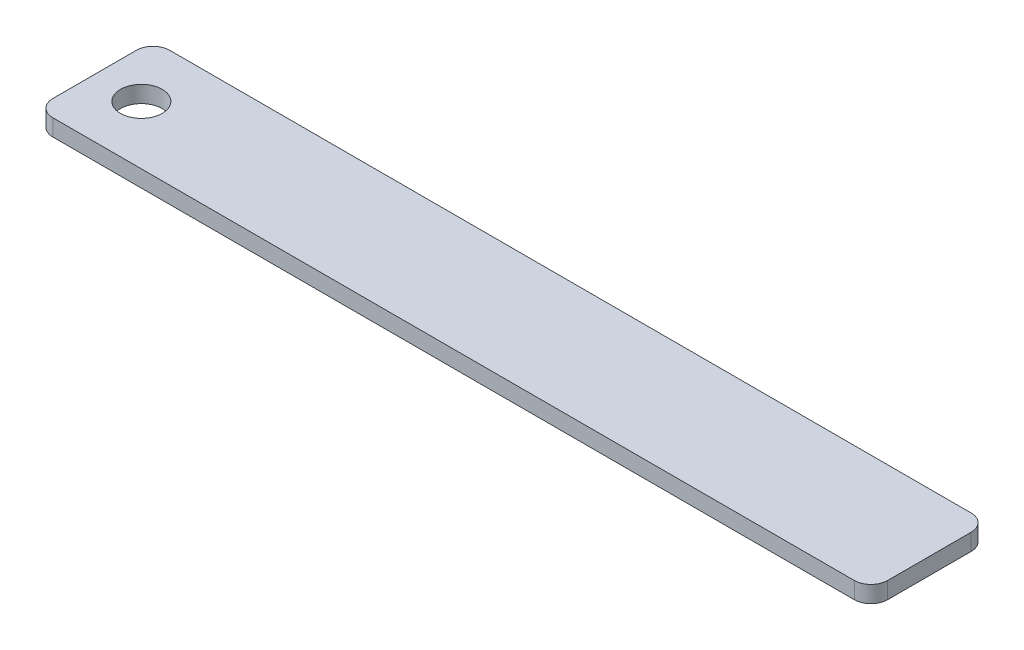
ISO-10303-21;
HEADER;
FILE_DESCRIPTION(('STEP AP214'),'2;1');
FILE_NAME('part.step','',(''),(''),'','','');
FILE_SCHEMA(('AUTOMOTIVE_DESIGN { 1 0 10303 214 1 1 1 1 }'));
ENDSEC;
DATA;
#1=APPLICATION_CONTEXT('core data for automotive mechanical design processes');
#2=APPLICATION_PROTOCOL_DEFINITION('international standard','automotive_design',2000,#1);
#3=PRODUCT_CONTEXT('',#1,'mechanical');
#4=PRODUCT('Part','Part','',(#3));
#5=PRODUCT_RELATED_PRODUCT_CATEGORY('part','',(#4));
#6=PRODUCT_DEFINITION_FORMATION('','',#4);
#7=PRODUCT_DEFINITION_CONTEXT('part definition',#1,'design');
#8=PRODUCT_DEFINITION('design','',#6,#7);
#9=PRODUCT_DEFINITION_SHAPE('','',#8);
#10=(LENGTH_UNIT() NAMED_UNIT(*) SI_UNIT(.MILLI.,.METRE.));
#11=(NAMED_UNIT(*) PLANE_ANGLE_UNIT() SI_UNIT($,.RADIAN.));
#12=(NAMED_UNIT(*) SI_UNIT($,.STERADIAN.) SOLID_ANGLE_UNIT());
#13=UNCERTAINTY_MEASURE_WITH_UNIT(LENGTH_MEASURE(1.E-05),#10,'distance_accuracy_value','');
#14=(GEOMETRIC_REPRESENTATION_CONTEXT(3) GLOBAL_UNCERTAINTY_ASSIGNED_CONTEXT((#13)) GLOBAL_UNIT_ASSIGNED_CONTEXT((#10,
#11,#12)) REPRESENTATION_CONTEXT('',''));
#15=CARTESIAN_POINT('',(0.,0.,0.));
#16=DIRECTION('',(0.,0.,1.));
#17=DIRECTION('',(1.,0.,0.));
#18=AXIS2_PLACEMENT_3D('',#15,#16,#17);
#19=CARTESIAN_POINT('',(0.,1.27,0.));
#20=DIRECTION('',(0.,-1.,0.));
#21=DIRECTION('',(0.,0.,-1.));
#22=AXIS2_PLACEMENT_3D('',#19,#20,#21);
#23=PLANE('',#22);
#24=DIRECTION('',(-1.,0.,0.));
#25=VECTOR('',#24,1.);
#26=CARTESIAN_POINT('',(-31.75,1.27,-4.445));
#27=LINE('',#26,#25);
#28=CARTESIAN_POINT('',(30.48,1.27,-4.445));
#29=VERTEX_POINT('',#28);
#30=CARTESIAN_POINT('',(-30.48,1.27,-4.445));
#31=VERTEX_POINT('',#30);
#32=EDGE_CURVE('E171',#29,#31,#27,.T.);
#33=ORIENTED_EDGE('',*,*,#32,.T.);
#34=CARTESIAN_POINT('',(-30.48,1.27,-3.175));
#35=DIRECTION('',(0.,-1.,0.));
#36=DIRECTION('',(0.,0.,-1.));
#37=AXIS2_PLACEMENT_3D('',#34,#35,#36);
#38=CIRCLE('',#37,1.27);
#39=CARTESIAN_POINT('',(-31.75,1.27,-3.175));
#40=VERTEX_POINT('',#39);
#41=EDGE_CURVE('E148',#31,#40,#38,.F.);
#42=ORIENTED_EDGE('',*,*,#41,.T.);
#43=DIRECTION('',(0.,0.,1.));
#44=VECTOR('',#43,1.);
#45=CARTESIAN_POINT('',(-31.75,1.27,4.445));
#46=LINE('',#45,#44);
#47=CARTESIAN_POINT('',(-31.75,1.27,3.175));
#48=VERTEX_POINT('',#47);
#49=EDGE_CURVE('E118',#40,#48,#46,.T.);
#50=ORIENTED_EDGE('',*,*,#49,.T.);
#51=CARTESIAN_POINT('',(-30.48,1.27,3.175));
#52=DIRECTION('',(0.,-1.,0.));
#53=DIRECTION('',(0.,0.,-1.));
#54=AXIS2_PLACEMENT_3D('',#51,#52,#53);
#55=CIRCLE('',#54,1.27);
#56=CARTESIAN_POINT('',(-30.48,1.27,4.445));
#57=VERTEX_POINT('',#56);
#58=EDGE_CURVE('E55',#48,#57,#55,.F.);
#59=ORIENTED_EDGE('',*,*,#58,.T.);
#60=DIRECTION('',(1.,0.,0.));
#61=VECTOR('',#60,1.);
#62=CARTESIAN_POINT('',(-31.75,1.27,4.445));
#63=LINE('',#62,#61);
#64=CARTESIAN_POINT('',(30.48,1.27,4.445));
#65=VERTEX_POINT('',#64);
#66=EDGE_CURVE('E134',#57,#65,#63,.T.);
#67=ORIENTED_EDGE('',*,*,#66,.T.);
#68=CARTESIAN_POINT('',(30.48,1.27,3.175));
#69=DIRECTION('',(0.,-1.,0.));
#70=DIRECTION('',(0.,0.,-1.));
#71=AXIS2_PLACEMENT_3D('',#68,#69,#70);
#72=CIRCLE('',#71,1.27);
#73=CARTESIAN_POINT('',(31.75,1.27,3.175));
#74=VERTEX_POINT('',#73);
#75=EDGE_CURVE('E143',#65,#74,#72,.F.);
#76=ORIENTED_EDGE('',*,*,#75,.T.);
#77=DIRECTION('',(0.,0.,-1.));
#78=VECTOR('',#77,1.);
#79=CARTESIAN_POINT('',(31.75,1.27,4.445));
#80=LINE('',#79,#78);
#81=CARTESIAN_POINT('',(31.75,1.27,-3.175));
#82=VERTEX_POINT('',#81);
#83=EDGE_CURVE('E128',#74,#82,#80,.T.);
#84=ORIENTED_EDGE('',*,*,#83,.T.);
#85=CARTESIAN_POINT('',(30.48,1.27,-3.175));
#86=DIRECTION('',(0.,-1.,0.));
#87=DIRECTION('',(0.,0.,-1.));
#88=AXIS2_PLACEMENT_3D('',#85,#86,#87);
#89=CIRCLE('',#88,1.27);
#90=EDGE_CURVE('E145',#82,#29,#89,.F.);
#91=ORIENTED_EDGE('',*,*,#90,.T.);
#92=EDGE_LOOP('',(#33,#42,#50,#59,#67,#76,#84,#91));
#93=FACE_BOUND('',#92,.T.);
#94=CARTESIAN_POINT('',(-28.194,1.27,0.));
#95=DIRECTION('',(0.,1.,0.));
#96=DIRECTION('',(0.,0.,1.));
#97=AXIS2_PLACEMENT_3D('',#94,#95,#96);
#98=CIRCLE('',#97,1.5875);
#99=CARTESIAN_POINT('',(-28.194,1.27,1.5875));
#100=VERTEX_POINT('',#99);
#101=EDGE_CURVE('E164',#100,#100,#98,.T.);
#102=ORIENTED_EDGE('',*,*,#101,.F.);
#103=EDGE_LOOP('',(#102));
#104=FACE_BOUND('',#103,.T.);
#105=ADVANCED_FACE('F33',(#93,#104),#23,.F.);
#106=CARTESIAN_POINT('',(0.,0.,0.));
#107=DIRECTION('',(0.,-1.,0.));
#108=DIRECTION('',(0.,0.,-1.));
#109=AXIS2_PLACEMENT_3D('',#106,#107,#108);
#110=PLANE('',#109);
#111=DIRECTION('',(0.,0.,1.));
#112=VECTOR('',#111,1.);
#113=CARTESIAN_POINT('',(-31.75,0.,4.445));
#114=LINE('',#113,#112);
#115=CARTESIAN_POINT('',(-31.75,0.,-3.175));
#116=VERTEX_POINT('',#115);
#117=CARTESIAN_POINT('',(-31.75,0.,3.175));
#118=VERTEX_POINT('',#117);
#119=EDGE_CURVE('E116',#116,#118,#114,.T.);
#120=ORIENTED_EDGE('',*,*,#119,.F.);
#121=CARTESIAN_POINT('',(-30.48,0.,-3.175));
#122=DIRECTION('',(0.,-1.,0.));
#123=DIRECTION('',(0.,0.,-1.));
#124=AXIS2_PLACEMENT_3D('',#121,#122,#123);
#125=CIRCLE('',#124,1.27);
#126=CARTESIAN_POINT('',(-30.48,0.,-4.445));
#127=VERTEX_POINT('',#126);
#128=EDGE_CURVE('E99',#116,#127,#125,.T.);
#129=ORIENTED_EDGE('',*,*,#128,.T.);
#130=DIRECTION('',(-1.,0.,0.));
#131=VECTOR('',#130,1.);
#132=CARTESIAN_POINT('',(-31.75,0.,-4.445));
#133=LINE('',#132,#131);
#134=CARTESIAN_POINT('',(30.48,0.,-4.445));
#135=VERTEX_POINT('',#134);
#136=EDGE_CURVE('E126',#135,#127,#133,.T.);
#137=ORIENTED_EDGE('',*,*,#136,.F.);
#138=CARTESIAN_POINT('',(30.48,0.,-3.175));
#139=DIRECTION('',(0.,-1.,0.));
#140=DIRECTION('',(0.,0.,-1.));
#141=AXIS2_PLACEMENT_3D('',#138,#139,#140);
#142=CIRCLE('',#141,1.27);
#143=CARTESIAN_POINT('',(31.75,0.,-3.175));
#144=VERTEX_POINT('',#143);
#145=EDGE_CURVE('E137',#135,#144,#142,.T.);
#146=ORIENTED_EDGE('',*,*,#145,.T.);
#147=DIRECTION('',(0.,0.,-1.));
#148=VECTOR('',#147,1.);
#149=CARTESIAN_POINT('',(31.75,0.,4.445));
#150=LINE('',#149,#148);
#151=CARTESIAN_POINT('',(31.75,0.,3.175));
#152=VERTEX_POINT('',#151);
#153=EDGE_CURVE('E130',#152,#144,#150,.T.);
#154=ORIENTED_EDGE('',*,*,#153,.F.);
#155=CARTESIAN_POINT('',(30.48,0.,3.175));
#156=DIRECTION('',(0.,-1.,0.));
#157=DIRECTION('',(0.,0.,-1.));
#158=AXIS2_PLACEMENT_3D('',#155,#156,#157);
#159=CIRCLE('',#158,1.27);
#160=CARTESIAN_POINT('',(30.48,0.,4.445));
#161=VERTEX_POINT('',#160);
#162=EDGE_CURVE('E119',#152,#161,#159,.T.);
#163=ORIENTED_EDGE('',*,*,#162,.T.);
#164=DIRECTION('',(1.,0.,0.));
#165=VECTOR('',#164,1.);
#166=CARTESIAN_POINT('',(-31.75,0.,4.445));
#167=LINE('',#166,#165);
#168=CARTESIAN_POINT('',(-30.48,0.,4.445));
#169=VERTEX_POINT('',#168);
#170=EDGE_CURVE('E125',#169,#161,#167,.T.);
#171=ORIENTED_EDGE('',*,*,#170,.F.);
#172=CARTESIAN_POINT('',(-30.48,0.,3.175));
#173=DIRECTION('',(0.,-1.,0.));
#174=DIRECTION('',(0.,0.,-1.));
#175=AXIS2_PLACEMENT_3D('',#172,#173,#174);
#176=CIRCLE('',#175,1.27);
#177=EDGE_CURVE('E110',#169,#118,#176,.T.);
#178=ORIENTED_EDGE('',*,*,#177,.T.);
#179=EDGE_LOOP('',(#120,#129,#137,#146,#154,#163,#171,#178));
#180=FACE_BOUND('',#179,.T.);
#181=CARTESIAN_POINT('',(-28.194,0.,0.));
#182=DIRECTION('',(0.,1.,0.));
#183=DIRECTION('',(0.,0.,1.));
#184=AXIS2_PLACEMENT_3D('',#181,#182,#183);
#185=CIRCLE('',#184,1.5875);
#186=CARTESIAN_POINT('',(-28.194,0.,1.5875));
#187=VERTEX_POINT('',#186);
#188=EDGE_CURVE('E166',#187,#187,#185,.T.);
#189=ORIENTED_EDGE('',*,*,#188,.T.);
#190=EDGE_LOOP('',(#189));
#191=FACE_BOUND('',#190,.T.);
#192=ADVANCED_FACE('F122',(#180,#191),#110,.T.);
#193=CARTESIAN_POINT('',(31.75,1.27,4.445));
#194=DIRECTION('',(-1.,0.,0.));
#195=DIRECTION('',(0.,0.,1.));
#196=AXIS2_PLACEMENT_3D('',#193,#194,#195);
#197=PLANE('',#196);
#198=ORIENTED_EDGE('',*,*,#153,.T.);
#199=DIRECTION('',(0.,-1.,0.));
#200=VECTOR('',#199,1.);
#201=CARTESIAN_POINT('',(31.75,1.27,-3.175));
#202=LINE('',#201,#200);
#203=EDGE_CURVE('E11',#144,#82,#202,.F.);
#204=ORIENTED_EDGE('',*,*,#203,.T.);
#205=ORIENTED_EDGE('',*,*,#83,.F.);
#206=DIRECTION('',(0.,-1.,0.));
#207=VECTOR('',#206,1.);
#208=CARTESIAN_POINT('',(31.75,1.27,3.175));
#209=LINE('',#208,#207);
#210=EDGE_CURVE('E41',#74,#152,#209,.T.);
#211=ORIENTED_EDGE('',*,*,#210,.T.);
#212=EDGE_LOOP('',(#198,#204,#205,#211));
#213=FACE_BOUND('',#212,.T.);
#214=ADVANCED_FACE('F159',(#213),#197,.F.);
#215=CARTESIAN_POINT('',(-31.75,1.27,-4.445));
#216=DIRECTION('',(0.,0.,1.));
#217=DIRECTION('',(1.,0.,0.));
#218=AXIS2_PLACEMENT_3D('',#215,#216,#217);
#219=PLANE('',#218);
#220=ORIENTED_EDGE('',*,*,#136,.T.);
#221=DIRECTION('',(0.,-1.,0.));
#222=VECTOR('',#221,1.);
#223=CARTESIAN_POINT('',(-30.48,1.27,-4.445));
#224=LINE('',#223,#222);
#225=EDGE_CURVE('E104',#127,#31,#224,.F.);
#226=ORIENTED_EDGE('',*,*,#225,.T.);
#227=ORIENTED_EDGE('',*,*,#32,.F.);
#228=DIRECTION('',(0.,-1.,0.));
#229=VECTOR('',#228,1.);
#230=CARTESIAN_POINT('',(30.48,1.27,-4.445));
#231=LINE('',#230,#229);
#232=EDGE_CURVE('E109',#29,#135,#231,.T.);
#233=ORIENTED_EDGE('',*,*,#232,.T.);
#234=EDGE_LOOP('',(#220,#226,#227,#233));
#235=FACE_BOUND('',#234,.T.);
#236=ADVANCED_FACE('F200',(#235),#219,.F.);
#237=CARTESIAN_POINT('',(-31.75,1.27,4.445));
#238=DIRECTION('',(1.,0.,0.));
#239=DIRECTION('',(0.,0.,-1.));
#240=AXIS2_PLACEMENT_3D('',#237,#238,#239);
#241=PLANE('',#240);
#242=ORIENTED_EDGE('',*,*,#49,.F.);
#243=DIRECTION('',(0.,-1.,0.));
#244=VECTOR('',#243,1.);
#245=CARTESIAN_POINT('',(-31.75,1.27,-3.175));
#246=LINE('',#245,#244);
#247=EDGE_CURVE('E103',#40,#116,#246,.T.);
#248=ORIENTED_EDGE('',*,*,#247,.T.);
#249=ORIENTED_EDGE('',*,*,#119,.T.);
#250=DIRECTION('',(0.,-1.,0.));
#251=VECTOR('',#250,1.);
#252=CARTESIAN_POINT('',(-31.75,1.27,3.175));
#253=LINE('',#252,#251);
#254=EDGE_CURVE('E120',#118,#48,#253,.F.);
#255=ORIENTED_EDGE('',*,*,#254,.T.);
#256=EDGE_LOOP('',(#242,#248,#249,#255));
#257=FACE_BOUND('',#256,.T.);
#258=ADVANCED_FACE('F115',(#257),#241,.F.);
#259=CARTESIAN_POINT('',(-31.75,1.27,4.445));
#260=DIRECTION('',(0.,0.,-1.));
#261=DIRECTION('',(-1.,0.,0.));
#262=AXIS2_PLACEMENT_3D('',#259,#260,#261);
#263=PLANE('',#262);
#264=ORIENTED_EDGE('',*,*,#66,.F.);
#265=DIRECTION('',(0.,-1.,0.));
#266=VECTOR('',#265,1.);
#267=CARTESIAN_POINT('',(-30.48,1.27,4.445));
#268=LINE('',#267,#266);
#269=EDGE_CURVE('E151',#57,#169,#268,.T.);
#270=ORIENTED_EDGE('',*,*,#269,.T.);
#271=ORIENTED_EDGE('',*,*,#170,.T.);
#272=DIRECTION('',(0.,-1.,0.));
#273=VECTOR('',#272,1.);
#274=CARTESIAN_POINT('',(30.48,1.27,4.445));
#275=LINE('',#274,#273);
#276=EDGE_CURVE('E48',#161,#65,#275,.F.);
#277=ORIENTED_EDGE('',*,*,#276,.T.);
#278=EDGE_LOOP('',(#264,#270,#271,#277));
#279=FACE_BOUND('',#278,.T.);
#280=ADVANCED_FACE('F180',(#279),#263,.F.);
#281=CARTESIAN_POINT('',(-28.194,1.27,0.));
#282=DIRECTION('',(0.,-1.,0.));
#283=DIRECTION('',(0.,0.,-1.));
#284=AXIS2_PLACEMENT_3D('',#281,#282,#283);
#285=CYLINDRICAL_SURFACE('',#284,1.5875);
#286=ORIENTED_EDGE('',*,*,#101,.T.);
#287=EDGE_LOOP('',(#286));
#288=FACE_BOUND('',#287,.T.);
#289=ORIENTED_EDGE('',*,*,#188,.F.);
#290=EDGE_LOOP('',(#289));
#291=FACE_BOUND('',#290,.T.);
#292=ADVANCED_FACE('F178',(#288,#291),#285,.F.);
#293=CARTESIAN_POINT('',(-30.48,1.27,-3.175));
#294=DIRECTION('',(0.,-1.,0.));
#295=DIRECTION('',(0.,0.,-1.));
#296=AXIS2_PLACEMENT_3D('',#293,#294,#295);
#297=CYLINDRICAL_SURFACE('',#296,1.27);
#298=ORIENTED_EDGE('',*,*,#41,.F.);
#299=ORIENTED_EDGE('',*,*,#225,.F.);
#300=ORIENTED_EDGE('',*,*,#128,.F.);
#301=ORIENTED_EDGE('',*,*,#247,.F.);
#302=EDGE_LOOP('',(#298,#299,#300,#301));
#303=FACE_BOUND('',#302,.T.);
#304=ADVANCED_FACE('F102',(#303),#297,.T.);
#305=CARTESIAN_POINT('',(-30.48,1.27,3.175));
#306=DIRECTION('',(0.,-1.,0.));
#307=DIRECTION('',(0.,0.,-1.));
#308=AXIS2_PLACEMENT_3D('',#305,#306,#307);
#309=CYLINDRICAL_SURFACE('',#308,1.27);
#310=ORIENTED_EDGE('',*,*,#58,.F.);
#311=ORIENTED_EDGE('',*,*,#254,.F.);
#312=ORIENTED_EDGE('',*,*,#177,.F.);
#313=ORIENTED_EDGE('',*,*,#269,.F.);
#314=EDGE_LOOP('',(#310,#311,#312,#313));
#315=FACE_BOUND('',#314,.T.);
#316=ADVANCED_FACE('F187',(#315),#309,.T.);
#317=CARTESIAN_POINT('',(30.48,1.27,-3.175));
#318=DIRECTION('',(0.,-1.,0.));
#319=DIRECTION('',(0.,0.,-1.));
#320=AXIS2_PLACEMENT_3D('',#317,#318,#319);
#321=CYLINDRICAL_SURFACE('',#320,1.27);
#322=ORIENTED_EDGE('',*,*,#90,.F.);
#323=ORIENTED_EDGE('',*,*,#203,.F.);
#324=ORIENTED_EDGE('',*,*,#145,.F.);
#325=ORIENTED_EDGE('',*,*,#232,.F.);
#326=EDGE_LOOP('',(#322,#323,#324,#325));
#327=FACE_BOUND('',#326,.T.);
#328=ADVANCED_FACE('F207',(#327),#321,.T.);
#329=CARTESIAN_POINT('',(30.48,1.27,3.175));
#330=DIRECTION('',(0.,-1.,0.));
#331=DIRECTION('',(0.,0.,-1.));
#332=AXIS2_PLACEMENT_3D('',#329,#330,#331);
#333=CYLINDRICAL_SURFACE('',#332,1.27);
#334=ORIENTED_EDGE('',*,*,#75,.F.);
#335=ORIENTED_EDGE('',*,*,#276,.F.);
#336=ORIENTED_EDGE('',*,*,#162,.F.);
#337=ORIENTED_EDGE('',*,*,#210,.F.);
#338=EDGE_LOOP('',(#334,#335,#336,#337));
#339=FACE_BOUND('',#338,.T.);
#340=ADVANCED_FACE('F35',(#339),#333,.T.);
#341=CLOSED_SHELL('',(#105,#192,#214,#236,#258,#280,#292,#304,#316,#328,#340));
#342=MANIFOLD_SOLID_BREP('B2',#341);
#343=ADVANCED_BREP_SHAPE_REPRESENTATION('',(#18,#342),#14);
#344=SHAPE_DEFINITION_REPRESENTATION(#9,#343);
ENDSEC;
END-ISO-10303-21;
